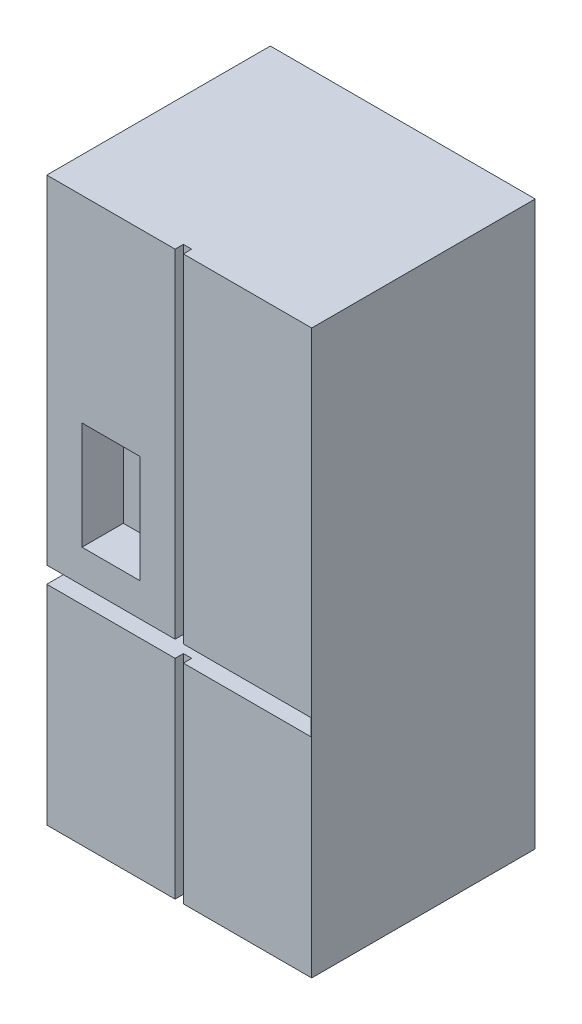
ISO-10303-21;
HEADER;
FILE_DESCRIPTION(('STEP AP214'),'2;1');
FILE_NAME('part.step','',(''),(''),'','','');
FILE_SCHEMA(('AUTOMOTIVE_DESIGN { 1 0 10303 214 1 1 1 1 }'));
ENDSEC;
DATA;
#1=APPLICATION_CONTEXT('core data for automotive mechanical design processes');
#2=APPLICATION_PROTOCOL_DEFINITION('international standard','automotive_design',2000,#1);
#3=PRODUCT_CONTEXT('',#1,'mechanical');
#4=PRODUCT('Part','Part','',(#3));
#5=PRODUCT_RELATED_PRODUCT_CATEGORY('part','',(#4));
#6=PRODUCT_DEFINITION_FORMATION('','',#4);
#7=PRODUCT_DEFINITION_CONTEXT('part definition',#1,'design');
#8=PRODUCT_DEFINITION('design','',#6,#7);
#9=PRODUCT_DEFINITION_SHAPE('','',#8);
#10=(LENGTH_UNIT() NAMED_UNIT(*) SI_UNIT(.MILLI.,.METRE.));
#11=(NAMED_UNIT(*) PLANE_ANGLE_UNIT() SI_UNIT($,.RADIAN.));
#12=(NAMED_UNIT(*) SI_UNIT($,.STERADIAN.) SOLID_ANGLE_UNIT());
#13=UNCERTAINTY_MEASURE_WITH_UNIT(LENGTH_MEASURE(1.E-05),#10,'distance_accuracy_value','');
#14=(GEOMETRIC_REPRESENTATION_CONTEXT(3) GLOBAL_UNCERTAINTY_ASSIGNED_CONTEXT((#13)) GLOBAL_UNIT_ASSIGNED_CONTEXT((#10,
#11,#12)) REPRESENTATION_CONTEXT('',''));
#15=CARTESIAN_POINT('',(0.,0.,0.));
#16=DIRECTION('',(0.,0.,1.));
#17=DIRECTION('',(1.,0.,0.));
#18=AXIS2_PLACEMENT_3D('',#15,#16,#17);
#19=CARTESIAN_POINT('',(0.,0.,-31.));
#20=DIRECTION('',(0.,0.,1.));
#21=DIRECTION('',(1.,0.,0.));
#22=AXIS2_PLACEMENT_3D('',#19,#20,#21);
#23=PLANE('',#22);
#24=DIRECTION('',(0.,-1.,0.));
#25=VECTOR('',#24,1.);
#26=CARTESIAN_POINT('',(-40.5,46.1924165792186,-31.));
#27=LINE('',#26,#25);
#28=CARTESIAN_POINT('',(-40.5,46.1924165792186,-31.));
#29=VERTEX_POINT('',#28);
#30=CARTESIAN_POINT('',(-40.5,33.1924165792186,-31.));
#31=VERTEX_POINT('',#30);
#32=EDGE_CURVE('E53',#29,#31,#27,.T.);
#33=ORIENTED_EDGE('',*,*,#32,.F.);
#34=DIRECTION('',(-1.,0.,0.));
#35=VECTOR('',#34,1.);
#36=CARTESIAN_POINT('',(-40.5,46.1924165792186,-31.));
#37=LINE('',#36,#35);
#38=CARTESIAN_POINT('',(-33.5,46.1924165792186,-31.));
#39=VERTEX_POINT('',#38);
#40=EDGE_CURVE('E194',#39,#29,#37,.T.);
#41=ORIENTED_EDGE('',*,*,#40,.F.);
#42=DIRECTION('',(0.,1.,0.));
#43=VECTOR('',#42,1.);
#44=CARTESIAN_POINT('',(-33.5,46.1924165792186,-31.));
#45=LINE('',#44,#43);
#46=CARTESIAN_POINT('',(-33.5,33.1924165792186,-31.));
#47=VERTEX_POINT('',#46);
#48=EDGE_CURVE('E197',#47,#39,#45,.T.);
#49=ORIENTED_EDGE('',*,*,#48,.F.);
#50=DIRECTION('',(1.,0.,0.));
#51=VECTOR('',#50,1.);
#52=CARTESIAN_POINT('',(-40.5,33.1924165792186,-31.));
#53=LINE('',#52,#51);
#54=EDGE_CURVE('E203',#31,#47,#53,.T.);
#55=ORIENTED_EDGE('',*,*,#54,.F.);
#56=EDGE_LOOP('',(#33,#41,#49,#55));
#57=FACE_BOUND('',#56,.T.);
#58=DIRECTION('',(-1.,0.,0.));
#59=VECTOR('',#58,1.);
#60=CARTESIAN_POINT('',(-44.75,29.1924165792186,-31.));
#61=LINE('',#60,#59);
#62=CARTESIAN_POINT('',(-29.25,29.1924165792186,-31.));
#63=VERTEX_POINT('',#62);
#64=CARTESIAN_POINT('',(-44.75,29.1924165792186,-31.));
#65=VERTEX_POINT('',#64);
#66=EDGE_CURVE('E232',#63,#65,#61,.T.);
#67=ORIENTED_EDGE('',*,*,#66,.F.);
#68=DIRECTION('',(0.,-1.,0.));
#69=VECTOR('',#68,1.);
#70=CARTESIAN_POINT('',(-29.25,70.,-31.));
#71=LINE('',#70,#69);
#72=CARTESIAN_POINT('',(-29.25,70.,-31.));
#73=VERTEX_POINT('',#72);
#74=EDGE_CURVE('E269',#73,#63,#71,.T.);
#75=ORIENTED_EDGE('',*,*,#74,.F.);
#76=DIRECTION('',(-1.,0.,0.));
#77=VECTOR('',#76,1.);
#78=CARTESIAN_POINT('',(-12.75,70.,-31.));
#79=LINE('',#78,#77);
#80=CARTESIAN_POINT('',(-44.75,70.,-31.));
#81=VERTEX_POINT('',#80);
#82=EDGE_CURVE('E289',#73,#81,#79,.T.);
#83=ORIENTED_EDGE('',*,*,#82,.T.);
#84=DIRECTION('',(0.,-1.,0.));
#85=VECTOR('',#84,1.);
#86=CARTESIAN_POINT('',(-44.75,2.,-31.));
#87=LINE('',#86,#85);
#88=EDGE_CURVE('E295',#81,#65,#87,.T.);
#89=ORIENTED_EDGE('',*,*,#88,.T.);
#90=EDGE_LOOP('',(#67,#75,#83,#89));
#91=FACE_BOUND('',#90,.T.);
#92=ADVANCED_FACE('F38',(#57,#91),#23,.T.);
#93=CARTESIAN_POINT('',(-29.25,70.,-32.));
#94=DIRECTION('',(-1.,0.,0.));
#95=DIRECTION('',(0.,-1.,0.));
#96=AXIS2_PLACEMENT_3D('',#93,#94,#95);
#97=PLANE('',#96);
#98=ORIENTED_EDGE('',*,*,#74,.T.);
#99=DIRECTION('',(0.,0.,-1.));
#100=VECTOR('',#99,1.);
#101=CARTESIAN_POINT('',(-29.25,29.1924165792186,-32.));
#102=LINE('',#101,#100);
#103=CARTESIAN_POINT('',(-29.25,29.1924165792186,-32.));
#104=VERTEX_POINT('',#103);
#105=EDGE_CURVE('E250',#63,#104,#102,.T.);
#106=ORIENTED_EDGE('',*,*,#105,.T.);
#107=DIRECTION('',(0.,-1.,0.));
#108=VECTOR('',#107,1.);
#109=CARTESIAN_POINT('',(-29.25,70.,-32.));
#110=LINE('',#109,#108);
#111=CARTESIAN_POINT('',(-29.25,70.,-32.));
#112=VERTEX_POINT('',#111);
#113=EDGE_CURVE('E254',#112,#104,#110,.T.);
#114=ORIENTED_EDGE('',*,*,#113,.F.);
#115=DIRECTION('',(0.,0.,1.));
#116=VECTOR('',#115,1.);
#117=CARTESIAN_POINT('',(-29.25,70.,-32.));
#118=LINE('',#117,#116);
#119=EDGE_CURVE('E276',#112,#73,#118,.T.);
#120=ORIENTED_EDGE('',*,*,#119,.T.);
#121=EDGE_LOOP('',(#98,#106,#114,#120));
#122=FACE_BOUND('',#121,.T.);
#123=ADVANCED_FACE('F363',(#122),#97,.F.);
#124=CARTESIAN_POINT('',(-28.25,70.,-32.));
#125=DIRECTION('',(1.,0.,0.));
#126=DIRECTION('',(0.,1.,0.));
#127=AXIS2_PLACEMENT_3D('',#124,#125,#126);
#128=PLANE('',#127);
#129=DIRECTION('',(0.,1.,0.));
#130=VECTOR('',#129,1.);
#131=CARTESIAN_POINT('',(-28.25,70.,-32.));
#132=LINE('',#131,#130);
#133=CARTESIAN_POINT('',(-28.25,29.1924165792186,-32.));
#134=VERTEX_POINT('',#133);
#135=CARTESIAN_POINT('',(-28.25,70.,-32.));
#136=VERTEX_POINT('',#135);
#137=EDGE_CURVE('E261',#134,#136,#132,.T.);
#138=ORIENTED_EDGE('',*,*,#137,.F.);
#139=DIRECTION('',(0.,0.,1.));
#140=VECTOR('',#139,1.);
#141=CARTESIAN_POINT('',(-28.25,29.1924165792186,-32.));
#142=LINE('',#141,#140);
#143=CARTESIAN_POINT('',(-28.25,29.1924165792186,-31.));
#144=VERTEX_POINT('',#143);
#145=EDGE_CURVE('E247',#134,#144,#142,.T.);
#146=ORIENTED_EDGE('',*,*,#145,.T.);
#147=DIRECTION('',(0.,1.,0.));
#148=VECTOR('',#147,1.);
#149=CARTESIAN_POINT('',(-28.25,70.,-31.));
#150=LINE('',#149,#148);
#151=CARTESIAN_POINT('',(-28.25,70.,-31.));
#152=VERTEX_POINT('',#151);
#153=EDGE_CURVE('E272',#144,#152,#150,.T.);
#154=ORIENTED_EDGE('',*,*,#153,.T.);
#155=DIRECTION('',(0.,0.,1.));
#156=VECTOR('',#155,1.);
#157=CARTESIAN_POINT('',(-28.25,70.,-32.));
#158=LINE('',#157,#156);
#159=EDGE_CURVE('E279',#136,#152,#158,.T.);
#160=ORIENTED_EDGE('',*,*,#159,.F.);
#161=EDGE_LOOP('',(#138,#146,#154,#160));
#162=FACE_BOUND('',#161,.T.);
#163=ADVANCED_FACE('F369',(#162),#128,.F.);
#164=CARTESIAN_POINT('',(0.,0.,-32.));
#165=DIRECTION('',(0.,0.,1.));
#166=DIRECTION('',(1.,0.,0.));
#167=AXIS2_PLACEMENT_3D('',#164,#165,#166);
#168=PLANE('',#167);
#169=DIRECTION('',(-1.,0.,0.));
#170=VECTOR('',#169,1.);
#171=CARTESIAN_POINT('',(0.,29.1924165792186,-32.));
#172=LINE('',#171,#170);
#173=EDGE_CURVE('E11',#134,#104,#172,.T.);
#174=ORIENTED_EDGE('',*,*,#173,.F.);
#175=ORIENTED_EDGE('',*,*,#137,.T.);
#176=DIRECTION('',(-1.,0.,0.));
#177=VECTOR('',#176,1.);
#178=CARTESIAN_POINT('',(-29.25,70.,-32.));
#179=LINE('',#178,#177);
#180=EDGE_CURVE('E265',#136,#112,#179,.T.);
#181=ORIENTED_EDGE('',*,*,#180,.T.);
#182=ORIENTED_EDGE('',*,*,#113,.T.);
#183=EDGE_LOOP('',(#174,#175,#181,#182));
#184=FACE_BOUND('',#183,.T.);
#185=ADVANCED_FACE('F381',(#184),#168,.T.);
#186=DIRECTION('',(1.,0.,0.));
#187=VECTOR('',#186,1.);
#188=CARTESIAN_POINT('',(-44.75,27.1924165792186,-31.));
#189=LINE('',#188,#187);
#190=CARTESIAN_POINT('',(-44.75,27.1924165792186,-31.));
#191=VERTEX_POINT('',#190);
#192=CARTESIAN_POINT('',(-29.25,27.1924165792186,-31.));
#193=VERTEX_POINT('',#192);
#194=EDGE_CURVE('E227',#191,#193,#189,.T.);
#195=ORIENTED_EDGE('',*,*,#194,.F.);
#196=CARTESIAN_POINT('',(-44.75,2.,-31.));
#197=VERTEX_POINT('',#196);
#198=EDGE_CURVE('E294',#191,#197,#87,.T.);
#199=ORIENTED_EDGE('',*,*,#198,.T.);
#200=DIRECTION('',(1.,0.,0.));
#201=VECTOR('',#200,1.);
#202=CARTESIAN_POINT('',(-12.75,2.,-31.));
#203=LINE('',#202,#201);
#204=CARTESIAN_POINT('',(-29.25,2.,-31.));
#205=VERTEX_POINT('',#204);
#206=EDGE_CURVE('E299',#197,#205,#203,.T.);
#207=ORIENTED_EDGE('',*,*,#206,.T.);
#208=EDGE_CURVE('E253',#193,#205,#71,.T.);
#209=ORIENTED_EDGE('',*,*,#208,.F.);
#210=EDGE_LOOP('',(#195,#199,#207,#209));
#211=FACE_BOUND('',#210,.T.);
#212=ADVANCED_FACE('F352',(#211),#23,.T.);
#213=CARTESIAN_POINT('',(-12.75,2.,-31.));
#214=DIRECTION('',(-1.,0.,0.));
#215=DIRECTION('',(0.,0.,1.));
#216=AXIS2_PLACEMENT_3D('',#213,#214,#215);
#217=PLANE('',#216);
#218=DIRECTION('',(0.,1.,0.));
#219=VECTOR('',#218,1.);
#220=CARTESIAN_POINT('',(-12.75,2.,-58.));
#221=LINE('',#220,#219);
#222=CARTESIAN_POINT('',(-12.75,2.,-58.));
#223=VERTEX_POINT('',#222);
#224=CARTESIAN_POINT('',(-12.75,70.,-58.));
#225=VERTEX_POINT('',#224);
#226=EDGE_CURVE('E278',#223,#225,#221,.T.);
#227=ORIENTED_EDGE('',*,*,#226,.T.);
#228=DIRECTION('',(0.,0.,-1.));
#229=VECTOR('',#228,1.);
#230=CARTESIAN_POINT('',(-12.75,70.,-31.));
#231=LINE('',#230,#229);
#232=CARTESIAN_POINT('',(-12.75,70.,-31.));
#233=VERTEX_POINT('',#232);
#234=EDGE_CURVE('E318',#233,#225,#231,.T.);
#235=ORIENTED_EDGE('',*,*,#234,.F.);
#236=DIRECTION('',(0.,1.,0.));
#237=VECTOR('',#236,1.);
#238=CARTESIAN_POINT('',(-12.75,2.,-31.));
#239=LINE('',#238,#237);
#240=CARTESIAN_POINT('',(-12.75,2.,-31.));
#241=VERTEX_POINT('',#240);
#242=EDGE_CURVE('E286',#241,#233,#239,.T.);
#243=ORIENTED_EDGE('',*,*,#242,.F.);
#244=DIRECTION('',(0.,0.,-1.));
#245=VECTOR('',#244,1.);
#246=CARTESIAN_POINT('',(-12.75,2.,-31.));
#247=LINE('',#246,#245);
#248=EDGE_CURVE('E302',#241,#223,#247,.T.);
#249=ORIENTED_EDGE('',*,*,#248,.T.);
#250=EDGE_LOOP('',(#227,#235,#243,#249));
#251=FACE_BOUND('',#250,.T.);
#252=ADVANCED_FACE('F40',(#251),#217,.F.);
#253=CARTESIAN_POINT('',(-12.75,70.,-31.));
#254=DIRECTION('',(0.,-1.,0.));
#255=DIRECTION('',(0.,0.,-1.));
#256=AXIS2_PLACEMENT_3D('',#253,#254,#255);
#257=PLANE('',#256);
#258=ORIENTED_EDGE('',*,*,#82,.F.);
#259=ORIENTED_EDGE('',*,*,#119,.F.);
#260=ORIENTED_EDGE('',*,*,#180,.F.);
#261=ORIENTED_EDGE('',*,*,#159,.T.);
#262=EDGE_CURVE('E291',#233,#152,#79,.T.);
#263=ORIENTED_EDGE('',*,*,#262,.F.);
#264=ORIENTED_EDGE('',*,*,#234,.T.);
#265=DIRECTION('',(-1.,0.,0.));
#266=VECTOR('',#265,1.);
#267=CARTESIAN_POINT('',(-12.75,70.,-58.));
#268=LINE('',#267,#266);
#269=CARTESIAN_POINT('',(-44.75,70.,-58.));
#270=VERTEX_POINT('',#269);
#271=EDGE_CURVE('E305',#225,#270,#268,.T.);
#272=ORIENTED_EDGE('',*,*,#271,.T.);
#273=DIRECTION('',(0.,0.,-1.));
#274=VECTOR('',#273,1.);
#275=CARTESIAN_POINT('',(-44.75,70.,-31.));
#276=LINE('',#275,#274);
#277=EDGE_CURVE('E315',#81,#270,#276,.T.);
#278=ORIENTED_EDGE('',*,*,#277,.F.);
#279=EDGE_LOOP('',(#258,#259,#260,#261,#263,#264,#272,#278));
#280=FACE_BOUND('',#279,.T.);
#281=ADVANCED_FACE('F390',(#280),#257,.F.);
#282=CARTESIAN_POINT('',(-44.75,2.,-31.));
#283=DIRECTION('',(1.,0.,0.));
#284=DIRECTION('',(0.,0.,-1.));
#285=AXIS2_PLACEMENT_3D('',#282,#283,#284);
#286=PLANE('',#285);
#287=DIRECTION('',(0.,-1.,0.));
#288=VECTOR('',#287,1.);
#289=CARTESIAN_POINT('',(-44.75,29.1924165792186,-41.));
#290=LINE('',#289,#288);
#291=CARTESIAN_POINT('',(-44.75,29.1924165792186,-41.));
#292=VERTEX_POINT('',#291);
#293=CARTESIAN_POINT('',(-44.75,27.1924165792186,-41.));
#294=VERTEX_POINT('',#293);
#295=EDGE_CURVE('E213',#292,#294,#290,.T.);
#296=ORIENTED_EDGE('',*,*,#295,.F.);
#297=DIRECTION('',(0.,0.,1.));
#298=VECTOR('',#297,1.);
#299=CARTESIAN_POINT('',(-44.75,29.1924165792186,-41.));
#300=LINE('',#299,#298);
#301=EDGE_CURVE('E234',#292,#65,#300,.T.);
#302=ORIENTED_EDGE('',*,*,#301,.T.);
#303=ORIENTED_EDGE('',*,*,#88,.F.);
#304=ORIENTED_EDGE('',*,*,#277,.T.);
#305=DIRECTION('',(0.,-1.,0.));
#306=VECTOR('',#305,1.);
#307=CARTESIAN_POINT('',(-44.75,2.,-58.));
#308=LINE('',#307,#306);
#309=CARTESIAN_POINT('',(-44.75,2.,-58.));
#310=VERTEX_POINT('',#309);
#311=EDGE_CURVE('E307',#270,#310,#308,.T.);
#312=ORIENTED_EDGE('',*,*,#311,.T.);
#313=DIRECTION('',(0.,0.,-1.));
#314=VECTOR('',#313,1.);
#315=CARTESIAN_POINT('',(-44.75,2.,-31.));
#316=LINE('',#315,#314);
#317=EDGE_CURVE('E312',#197,#310,#316,.T.);
#318=ORIENTED_EDGE('',*,*,#317,.F.);
#319=ORIENTED_EDGE('',*,*,#198,.F.);
#320=DIRECTION('',(0.,0.,1.));
#321=VECTOR('',#320,1.);
#322=CARTESIAN_POINT('',(-44.75,27.1924165792186,-41.));
#323=LINE('',#322,#321);
#324=EDGE_CURVE('E226',#294,#191,#323,.T.);
#325=ORIENTED_EDGE('',*,*,#324,.F.);
#326=EDGE_LOOP('',(#296,#302,#303,#304,#312,#318,#319,#325));
#327=FACE_BOUND('',#326,.T.);
#328=ADVANCED_FACE('F354',(#327),#286,.F.);
#329=CARTESIAN_POINT('',(-12.75,2.,-31.));
#330=DIRECTION('',(0.,1.,0.));
#331=DIRECTION('',(-1.,0.,0.));
#332=AXIS2_PLACEMENT_3D('',#329,#330,#331);
#333=PLANE('',#332);
#334=DIRECTION('',(1.,0.,0.));
#335=VECTOR('',#334,1.);
#336=CARTESIAN_POINT('',(-29.25,2.,-32.));
#337=LINE('',#336,#335);
#338=CARTESIAN_POINT('',(-29.25,2.,-32.));
#339=VERTEX_POINT('',#338);
#340=CARTESIAN_POINT('',(-28.25,2.,-32.));
#341=VERTEX_POINT('',#340);
#342=EDGE_CURVE('E257',#339,#341,#337,.T.);
#343=ORIENTED_EDGE('',*,*,#342,.F.);
#344=DIRECTION('',(0.,0.,1.));
#345=VECTOR('',#344,1.);
#346=CARTESIAN_POINT('',(-29.25,2.,-32.));
#347=LINE('',#346,#345);
#348=EDGE_CURVE('E268',#339,#205,#347,.T.);
#349=ORIENTED_EDGE('',*,*,#348,.T.);
#350=ORIENTED_EDGE('',*,*,#206,.F.);
#351=ORIENTED_EDGE('',*,*,#317,.T.);
#352=DIRECTION('',(1.,0.,0.));
#353=VECTOR('',#352,1.);
#354=CARTESIAN_POINT('',(-12.75,2.,-58.));
#355=LINE('',#354,#353);
#356=EDGE_CURVE('E290',#310,#223,#355,.T.);
#357=ORIENTED_EDGE('',*,*,#356,.T.);
#358=ORIENTED_EDGE('',*,*,#248,.F.);
#359=CARTESIAN_POINT('',(-28.25,2.,-31.));
#360=VERTEX_POINT('',#359);
#361=EDGE_CURVE('E298',#360,#241,#203,.T.);
#362=ORIENTED_EDGE('',*,*,#361,.F.);
#363=DIRECTION('',(0.,0.,1.));
#364=VECTOR('',#363,1.);
#365=CARTESIAN_POINT('',(-28.25,2.,-32.));
#366=LINE('',#365,#364);
#367=EDGE_CURVE('E282',#341,#360,#366,.T.);
#368=ORIENTED_EDGE('',*,*,#367,.F.);
#369=EDGE_LOOP('',(#343,#349,#350,#351,#357,#358,#362,#368));
#370=FACE_BOUND('',#369,.T.);
#371=ADVANCED_FACE('F333',(#370),#333,.F.);
#372=CARTESIAN_POINT('',(-12.85,29.1924165792186,-31.));
#373=VERTEX_POINT('',#372);
#374=EDGE_CURVE('E217',#373,#144,#61,.T.);
#375=ORIENTED_EDGE('',*,*,#374,.F.);
#376=DIRECTION('',(0.,1.,0.));
#377=VECTOR('',#376,1.);
#378=CARTESIAN_POINT('',(-12.85,29.1924165792186,-31.));
#379=LINE('',#378,#377);
#380=CARTESIAN_POINT('',(-12.85,27.1924165792186,-31.));
#381=VERTEX_POINT('',#380);
#382=EDGE_CURVE('E229',#381,#373,#379,.T.);
#383=ORIENTED_EDGE('',*,*,#382,.F.);
#384=CARTESIAN_POINT('',(-28.25,27.1924165792186,-31.));
#385=VERTEX_POINT('',#384);
#386=EDGE_CURVE('E209',#385,#381,#189,.T.);
#387=ORIENTED_EDGE('',*,*,#386,.F.);
#388=EDGE_CURVE('E273',#360,#385,#150,.T.);
#389=ORIENTED_EDGE('',*,*,#388,.F.);
#390=ORIENTED_EDGE('',*,*,#361,.T.);
#391=ORIENTED_EDGE('',*,*,#242,.T.);
#392=ORIENTED_EDGE('',*,*,#262,.T.);
#393=ORIENTED_EDGE('',*,*,#153,.F.);
#394=EDGE_LOOP('',(#375,#383,#387,#389,#390,#391,#392,#393));
#395=FACE_BOUND('',#394,.T.);
#396=ADVANCED_FACE('F337',(#395),#23,.T.);
#397=CARTESIAN_POINT('',(0.,0.,-58.));
#398=DIRECTION('',(0.,0.,1.));
#399=DIRECTION('',(1.,0.,0.));
#400=AXIS2_PLACEMENT_3D('',#397,#398,#399);
#401=PLANE('',#400);
#402=ORIENTED_EDGE('',*,*,#226,.F.);
#403=ORIENTED_EDGE('',*,*,#356,.F.);
#404=ORIENTED_EDGE('',*,*,#311,.F.);
#405=ORIENTED_EDGE('',*,*,#271,.F.);
#406=EDGE_LOOP('',(#402,#403,#404,#405));
#407=FACE_BOUND('',#406,.T.);
#408=ADVANCED_FACE('F361',(#407),#401,.F.);
#409=CARTESIAN_POINT('',(-29.25,27.1924165792186,-32.));
#410=VERTEX_POINT('',#409);
#411=EDGE_CURVE('E258',#410,#339,#110,.T.);
#412=ORIENTED_EDGE('',*,*,#411,.F.);
#413=DIRECTION('',(0.,0.,1.));
#414=VECTOR('',#413,1.);
#415=CARTESIAN_POINT('',(-29.25,27.1924165792186,-32.));
#416=LINE('',#415,#414);
#417=EDGE_CURVE('E61',#410,#193,#416,.T.);
#418=ORIENTED_EDGE('',*,*,#417,.T.);
#419=ORIENTED_EDGE('',*,*,#208,.T.);
#420=ORIENTED_EDGE('',*,*,#348,.F.);
#421=EDGE_LOOP('',(#412,#418,#419,#420));
#422=FACE_BOUND('',#421,.T.);
#423=ADVANCED_FACE('F359',(#422),#97,.F.);
#424=ORIENTED_EDGE('',*,*,#388,.T.);
#425=DIRECTION('',(0.,0.,-1.));
#426=VECTOR('',#425,1.);
#427=CARTESIAN_POINT('',(-28.25,27.1924165792186,-32.));
#428=LINE('',#427,#426);
#429=CARTESIAN_POINT('',(-28.25,27.1924165792186,-32.));
#430=VERTEX_POINT('',#429);
#431=EDGE_CURVE('E237',#385,#430,#428,.T.);
#432=ORIENTED_EDGE('',*,*,#431,.T.);
#433=EDGE_CURVE('E262',#341,#430,#132,.T.);
#434=ORIENTED_EDGE('',*,*,#433,.F.);
#435=ORIENTED_EDGE('',*,*,#367,.T.);
#436=EDGE_LOOP('',(#424,#432,#434,#435));
#437=FACE_BOUND('',#436,.T.);
#438=ADVANCED_FACE('F325',(#437),#128,.F.);
#439=DIRECTION('',(1.,0.,0.));
#440=VECTOR('',#439,1.);
#441=CARTESIAN_POINT('',(0.,27.1924165792186,-32.));
#442=LINE('',#441,#440);
#443=EDGE_CURVE('E46',#410,#430,#442,.T.);
#444=ORIENTED_EDGE('',*,*,#443,.F.);
#445=ORIENTED_EDGE('',*,*,#411,.T.);
#446=ORIENTED_EDGE('',*,*,#342,.T.);
#447=ORIENTED_EDGE('',*,*,#433,.T.);
#448=EDGE_LOOP('',(#444,#445,#446,#447));
#449=FACE_BOUND('',#448,.T.);
#450=ADVANCED_FACE('F327',(#449),#168,.T.);
#451=CARTESIAN_POINT('',(-44.75,29.1924165792186,-41.));
#452=DIRECTION('',(0.,1.,0.));
#453=DIRECTION('',(0.,0.,1.));
#454=AXIS2_PLACEMENT_3D('',#451,#452,#453);
#455=PLANE('',#454);
#456=ORIENTED_EDGE('',*,*,#66,.T.);
#457=ORIENTED_EDGE('',*,*,#301,.F.);
#458=DIRECTION('',(-1.,0.,0.));
#459=VECTOR('',#458,1.);
#460=CARTESIAN_POINT('',(-44.75,29.1924165792186,-41.));
#461=LINE('',#460,#459);
#462=CARTESIAN_POINT('',(-12.85,29.1924165792186,-41.));
#463=VERTEX_POINT('',#462);
#464=EDGE_CURVE('E223',#463,#292,#461,.T.);
#465=ORIENTED_EDGE('',*,*,#464,.F.);
#466=DIRECTION('',(0.,0.,1.));
#467=VECTOR('',#466,1.);
#468=CARTESIAN_POINT('',(-12.85,29.1924165792186,-41.));
#469=LINE('',#468,#467);
#470=EDGE_CURVE('E238',#463,#373,#469,.T.);
#471=ORIENTED_EDGE('',*,*,#470,.T.);
#472=ORIENTED_EDGE('',*,*,#374,.T.);
#473=ORIENTED_EDGE('',*,*,#145,.F.);
#474=ORIENTED_EDGE('',*,*,#173,.T.);
#475=ORIENTED_EDGE('',*,*,#105,.F.);
#476=EDGE_LOOP('',(#456,#457,#465,#471,#472,#473,#474,#475));
#477=FACE_BOUND('',#476,.T.);
#478=ADVANCED_FACE('F415',(#477),#455,.F.);
#479=CARTESIAN_POINT('',(-44.75,27.1924165792186,-41.));
#480=DIRECTION('',(0.,-1.,0.));
#481=DIRECTION('',(0.,0.,-1.));
#482=AXIS2_PLACEMENT_3D('',#479,#480,#481);
#483=PLANE('',#482);
#484=ORIENTED_EDGE('',*,*,#443,.T.);
#485=ORIENTED_EDGE('',*,*,#431,.F.);
#486=ORIENTED_EDGE('',*,*,#386,.T.);
#487=DIRECTION('',(0.,0.,1.));
#488=VECTOR('',#487,1.);
#489=CARTESIAN_POINT('',(-12.85,27.1924165792186,-41.));
#490=LINE('',#489,#488);
#491=CARTESIAN_POINT('',(-12.85,27.1924165792186,-41.));
#492=VERTEX_POINT('',#491);
#493=EDGE_CURVE('E240',#492,#381,#490,.T.);
#494=ORIENTED_EDGE('',*,*,#493,.F.);
#495=DIRECTION('',(1.,0.,0.));
#496=VECTOR('',#495,1.);
#497=CARTESIAN_POINT('',(-44.75,27.1924165792186,-41.));
#498=LINE('',#497,#496);
#499=EDGE_CURVE('E216',#294,#492,#498,.T.);
#500=ORIENTED_EDGE('',*,*,#499,.F.);
#501=ORIENTED_EDGE('',*,*,#324,.T.);
#502=ORIENTED_EDGE('',*,*,#194,.T.);
#503=ORIENTED_EDGE('',*,*,#417,.F.);
#504=EDGE_LOOP('',(#484,#485,#486,#494,#500,#501,#502,#503));
#505=FACE_BOUND('',#504,.T.);
#506=ADVANCED_FACE('F320',(#505),#483,.F.);
#507=CARTESIAN_POINT('',(-12.85,29.1924165792186,-41.));
#508=DIRECTION('',(1.,0.,0.));
#509=DIRECTION('',(0.,0.,-1.));
#510=AXIS2_PLACEMENT_3D('',#507,#508,#509);
#511=PLANE('',#510);
#512=ORIENTED_EDGE('',*,*,#382,.T.);
#513=ORIENTED_EDGE('',*,*,#470,.F.);
#514=DIRECTION('',(0.,1.,0.));
#515=VECTOR('',#514,1.);
#516=CARTESIAN_POINT('',(-12.85,29.1924165792186,-41.));
#517=LINE('',#516,#515);
#518=EDGE_CURVE('E220',#492,#463,#517,.T.);
#519=ORIENTED_EDGE('',*,*,#518,.F.);
#520=ORIENTED_EDGE('',*,*,#493,.T.);
#521=EDGE_LOOP('',(#512,#513,#519,#520));
#522=FACE_BOUND('',#521,.T.);
#523=ADVANCED_FACE('F341',(#522),#511,.F.);
#524=CARTESIAN_POINT('',(0.,0.,-41.));
#525=DIRECTION('',(0.,0.,1.));
#526=DIRECTION('',(1.,0.,0.));
#527=AXIS2_PLACEMENT_3D('',#524,#525,#526);
#528=PLANE('',#527);
#529=ORIENTED_EDGE('',*,*,#295,.T.);
#530=ORIENTED_EDGE('',*,*,#499,.T.);
#531=ORIENTED_EDGE('',*,*,#518,.T.);
#532=ORIENTED_EDGE('',*,*,#464,.T.);
#533=EDGE_LOOP('',(#529,#530,#531,#532));
#534=FACE_BOUND('',#533,.T.);
#535=ADVANCED_FACE('F344',(#534),#528,.T.);
#536=CARTESIAN_POINT('',(-40.5,46.1924165792186,-36.));
#537=DIRECTION('',(-1.,0.,0.));
#538=DIRECTION('',(0.,0.,1.));
#539=AXIS2_PLACEMENT_3D('',#536,#537,#538);
#540=PLANE('',#539);
#541=ORIENTED_EDGE('',*,*,#32,.T.);
#542=DIRECTION('',(0.,0.,1.));
#543=VECTOR('',#542,1.);
#544=CARTESIAN_POINT('',(-40.5,33.1924165792186,-36.));
#545=LINE('',#544,#543);
#546=CARTESIAN_POINT('',(-40.5,33.1924165792186,-36.));
#547=VERTEX_POINT('',#546);
#548=EDGE_CURVE('E172',#547,#31,#545,.T.);
#549=ORIENTED_EDGE('',*,*,#548,.F.);
#550=DIRECTION('',(0.,-1.,0.));
#551=VECTOR('',#550,1.);
#552=CARTESIAN_POINT('',(-40.5,46.1924165792186,-36.));
#553=LINE('',#552,#551);
#554=CARTESIAN_POINT('',(-40.5,46.1924165792186,-36.));
#555=VERTEX_POINT('',#554);
#556=EDGE_CURVE('E176',#555,#547,#553,.T.);
#557=ORIENTED_EDGE('',*,*,#556,.F.);
#558=DIRECTION('',(0.,0.,1.));
#559=VECTOR('',#558,1.);
#560=CARTESIAN_POINT('',(-40.5,46.1924165792186,-36.));
#561=LINE('',#560,#559);
#562=EDGE_CURVE('E207',#555,#29,#561,.T.);
#563=ORIENTED_EDGE('',*,*,#562,.T.);
#564=EDGE_LOOP('',(#541,#549,#557,#563));
#565=FACE_BOUND('',#564,.T.);
#566=ADVANCED_FACE('F174',(#565),#540,.F.);
#567=CARTESIAN_POINT('',(-40.5,46.1924165792186,-36.));
#568=DIRECTION('',(0.,1.,0.));
#569=DIRECTION('',(0.,0.,1.));
#570=AXIS2_PLACEMENT_3D('',#567,#568,#569);
#571=PLANE('',#570);
#572=ORIENTED_EDGE('',*,*,#40,.T.);
#573=ORIENTED_EDGE('',*,*,#562,.F.);
#574=DIRECTION('',(-1.,0.,0.));
#575=VECTOR('',#574,1.);
#576=CARTESIAN_POINT('',(-40.5,46.1924165792186,-36.));
#577=LINE('',#576,#575);
#578=CARTESIAN_POINT('',(-33.5,46.1924165792186,-36.));
#579=VERTEX_POINT('',#578);
#580=EDGE_CURVE('E182',#579,#555,#577,.T.);
#581=ORIENTED_EDGE('',*,*,#580,.F.);
#582=DIRECTION('',(0.,0.,1.));
#583=VECTOR('',#582,1.);
#584=CARTESIAN_POINT('',(-33.5,46.1924165792186,-36.));
#585=LINE('',#584,#583);
#586=EDGE_CURVE('E210',#579,#39,#585,.T.);
#587=ORIENTED_EDGE('',*,*,#586,.T.);
#588=EDGE_LOOP('',(#572,#573,#581,#587));
#589=FACE_BOUND('',#588,.T.);
#590=ADVANCED_FACE('F433',(#589),#571,.F.);
#591=CARTESIAN_POINT('',(-33.5,46.1924165792186,-36.));
#592=DIRECTION('',(1.,0.,0.));
#593=DIRECTION('',(0.,0.,-1.));
#594=AXIS2_PLACEMENT_3D('',#591,#592,#593);
#595=PLANE('',#594);
#596=ORIENTED_EDGE('',*,*,#48,.T.);
#597=ORIENTED_EDGE('',*,*,#586,.F.);
#598=DIRECTION('',(0.,1.,0.));
#599=VECTOR('',#598,1.);
#600=CARTESIAN_POINT('',(-33.5,46.1924165792186,-36.));
#601=LINE('',#600,#599);
#602=CARTESIAN_POINT('',(-33.5,33.1924165792186,-36.));
#603=VERTEX_POINT('',#602);
#604=EDGE_CURVE('E190',#603,#579,#601,.T.);
#605=ORIENTED_EDGE('',*,*,#604,.F.);
#606=DIRECTION('',(0.,0.,1.));
#607=VECTOR('',#606,1.);
#608=CARTESIAN_POINT('',(-33.5,33.1924165792186,-36.));
#609=LINE('',#608,#607);
#610=EDGE_CURVE('E181',#603,#47,#609,.T.);
#611=ORIENTED_EDGE('',*,*,#610,.T.);
#612=EDGE_LOOP('',(#596,#597,#605,#611));
#613=FACE_BOUND('',#612,.T.);
#614=ADVANCED_FACE('F436',(#613),#595,.F.);
#615=CARTESIAN_POINT('',(-40.5,33.1924165792186,-36.));
#616=DIRECTION('',(0.,-1.,0.));
#617=DIRECTION('',(0.,0.,-1.));
#618=AXIS2_PLACEMENT_3D('',#615,#616,#617);
#619=PLANE('',#618);
#620=ORIENTED_EDGE('',*,*,#54,.T.);
#621=ORIENTED_EDGE('',*,*,#610,.F.);
#622=DIRECTION('',(1.,0.,0.));
#623=VECTOR('',#622,1.);
#624=CARTESIAN_POINT('',(-40.5,33.1924165792186,-36.));
#625=LINE('',#624,#623);
#626=EDGE_CURVE('E185',#547,#603,#625,.T.);
#627=ORIENTED_EDGE('',*,*,#626,.F.);
#628=ORIENTED_EDGE('',*,*,#548,.T.);
#629=EDGE_LOOP('',(#620,#621,#627,#628));
#630=FACE_BOUND('',#629,.T.);
#631=ADVANCED_FACE('F186',(#630),#619,.F.);
#632=CARTESIAN_POINT('',(0.,0.,-36.));
#633=DIRECTION('',(0.,0.,1.));
#634=DIRECTION('',(1.,0.,0.));
#635=AXIS2_PLACEMENT_3D('',#632,#633,#634);
#636=PLANE('',#635);
#637=ORIENTED_EDGE('',*,*,#556,.T.);
#638=ORIENTED_EDGE('',*,*,#626,.T.);
#639=ORIENTED_EDGE('',*,*,#604,.T.);
#640=ORIENTED_EDGE('',*,*,#580,.T.);
#641=EDGE_LOOP('',(#637,#638,#639,#640));
#642=FACE_BOUND('',#641,.T.);
#643=ADVANCED_FACE('F192',(#642),#636,.T.);
#644=CLOSED_SHELL('',(#92,#123,#163,#185,#212,#252,#281,#328,#371,#396,#408,#423,#438,#450,#478,
#506,#523,#535,#566,#590,#614,#631,#643));
#645=MANIFOLD_SOLID_BREP('B2',#644);
#646=ADVANCED_BREP_SHAPE_REPRESENTATION('',(#18,#645),#14);
#647=SHAPE_DEFINITION_REPRESENTATION(#9,#646);
ENDSEC;
END-ISO-10303-21;
